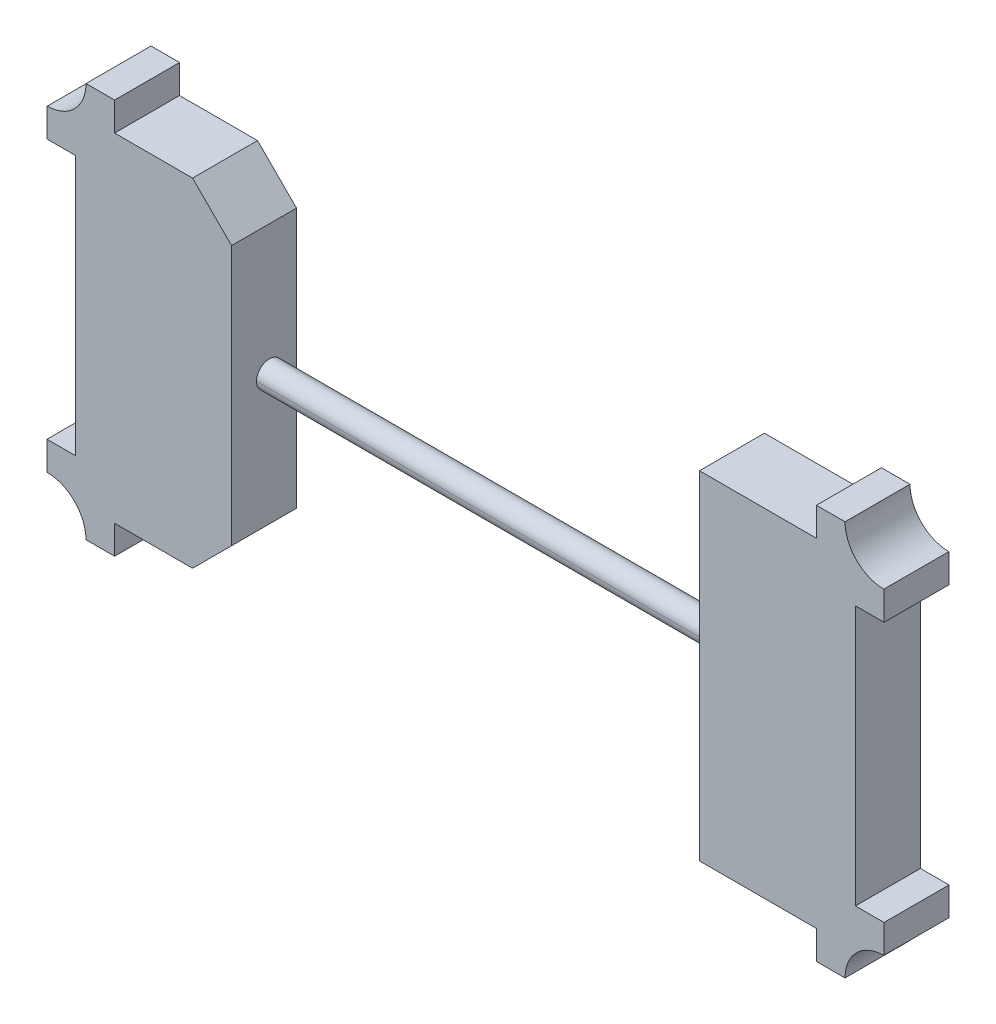
ISO-10303-21;
HEADER;
FILE_DESCRIPTION(('STEP AP214'),'2;1');
FILE_NAME('part.step','',(''),(''),'','','');
FILE_SCHEMA(('AUTOMOTIVE_DESIGN { 1 0 10303 214 1 1 1 1 }'));
ENDSEC;
DATA;
#1=APPLICATION_CONTEXT('core data for automotive mechanical design processes');
#2=APPLICATION_PROTOCOL_DEFINITION('international standard','automotive_design',2000,#1);
#3=PRODUCT_CONTEXT('',#1,'mechanical');
#4=PRODUCT('Part','Part','',(#3));
#5=PRODUCT_RELATED_PRODUCT_CATEGORY('part','',(#4));
#6=PRODUCT_DEFINITION_FORMATION('','',#4);
#7=PRODUCT_DEFINITION_CONTEXT('part definition',#1,'design');
#8=PRODUCT_DEFINITION('design','',#6,#7);
#9=PRODUCT_DEFINITION_SHAPE('','',#8);
#10=(LENGTH_UNIT() NAMED_UNIT(*) SI_UNIT(.MILLI.,.METRE.));
#11=(NAMED_UNIT(*) PLANE_ANGLE_UNIT() SI_UNIT($,.RADIAN.));
#12=(NAMED_UNIT(*) SI_UNIT($,.STERADIAN.) SOLID_ANGLE_UNIT());
#13=UNCERTAINTY_MEASURE_WITH_UNIT(LENGTH_MEASURE(1.E-05),#10,'distance_accuracy_value','');
#14=(GEOMETRIC_REPRESENTATION_CONTEXT(3) GLOBAL_UNCERTAINTY_ASSIGNED_CONTEXT((#13)) GLOBAL_UNIT_ASSIGNED_CONTEXT((#10,
#11,#12)) REPRESENTATION_CONTEXT('',''));
#15=CARTESIAN_POINT('',(0.,0.,0.));
#16=DIRECTION('',(0.,0.,1.));
#17=DIRECTION('',(1.,0.,0.));
#18=AXIS2_PLACEMENT_3D('',#15,#16,#17);
#19=CARTESIAN_POINT('',(-1.555,0.5,0.));
#20=DIRECTION('',(0.,-1.,0.));
#21=DIRECTION('',(-1.,0.,0.));
#22=AXIS2_PLACEMENT_3D('',#19,#20,#21);
#23=PLANE('',#22);
#24=DIRECTION('',(1.,0.,0.));
#25=VECTOR('',#24,1.);
#26=CARTESIAN_POINT('',(-1.26844322738,0.5,0.));
#27=LINE('',#26,#25);
#28=CARTESIAN_POINT('',(-1.61,0.5,0.));
#29=VERTEX_POINT('',#28);
#30=CARTESIAN_POINT('',(-1.5,0.5,0.));
#31=VERTEX_POINT('',#30);
#32=EDGE_CURVE('E474',#29,#31,#27,.T.);
#33=ORIENTED_EDGE('',*,*,#32,.T.);
#34=DIRECTION('',(0.,0.,-1.));
#35=VECTOR('',#34,1.);
#36=CARTESIAN_POINT('',(-1.5,0.5,0.));
#37=LINE('',#36,#35);
#38=CARTESIAN_POINT('',(-1.5,0.5,0.25));
#39=VERTEX_POINT('',#38);
#40=EDGE_CURVE('E11',#39,#31,#37,.T.);
#41=ORIENTED_EDGE('',*,*,#40,.F.);
#42=DIRECTION('',(1.,0.,0.));
#43=VECTOR('',#42,1.);
#44=CARTESIAN_POINT('',(-1.26844322738,0.5,0.25));
#45=LINE('',#44,#43);
#46=CARTESIAN_POINT('',(-1.61,0.5,0.25));
#47=VERTEX_POINT('',#46);
#48=EDGE_CURVE('E478',#47,#39,#45,.T.);
#49=ORIENTED_EDGE('',*,*,#48,.F.);
#50=DIRECTION('',(0.,0.,1.));
#51=VECTOR('',#50,1.);
#52=CARTESIAN_POINT('',(-1.61,0.5,0.));
#53=LINE('',#52,#51);
#54=EDGE_CURVE('E372',#29,#47,#53,.T.);
#55=ORIENTED_EDGE('',*,*,#54,.F.);
#56=EDGE_LOOP('',(#33,#41,#49,#55));
#57=FACE_BOUND('',#56,.T.);
#58=ADVANCED_FACE('F16',(#57),#23,.T.);
#59=CARTESIAN_POINT('',(-1.5,0.25,0.));
#60=DIRECTION('',(-1.,0.,0.));
#61=DIRECTION('',(0.,0.,1.));
#62=AXIS2_PLACEMENT_3D('',#59,#60,#61);
#63=PLANE('',#62);
#64=DIRECTION('',(0.,-1.,0.));
#65=VECTOR('',#64,1.);
#66=CARTESIAN_POINT('',(-1.5,0.,0.));
#67=LINE('',#66,#65);
#68=CARTESIAN_POINT('',(-1.5,-0.5,0.));
#69=VERTEX_POINT('',#68);
#70=EDGE_CURVE('E553',#31,#69,#67,.T.);
#71=ORIENTED_EDGE('',*,*,#70,.T.);
#72=DIRECTION('',(0.,0.,-1.));
#73=VECTOR('',#72,1.);
#74=CARTESIAN_POINT('',(-1.5,-0.5,0.));
#75=LINE('',#74,#73);
#76=CARTESIAN_POINT('',(-1.5,-0.5,0.25));
#77=VERTEX_POINT('',#76);
#78=EDGE_CURVE('E27',#77,#69,#75,.T.);
#79=ORIENTED_EDGE('',*,*,#78,.F.);
#80=DIRECTION('',(0.,-1.,0.));
#81=VECTOR('',#80,1.);
#82=CARTESIAN_POINT('',(-1.5,0.,0.25));
#83=LINE('',#82,#81);
#84=EDGE_CURVE('E314',#39,#77,#83,.T.);
#85=ORIENTED_EDGE('',*,*,#84,.F.);
#86=ORIENTED_EDGE('',*,*,#40,.T.);
#87=EDGE_LOOP('',(#71,#79,#85,#86));
#88=FACE_BOUND('',#87,.T.);
#89=ADVANCED_FACE('F663',(#88),#63,.T.);
#90=CARTESIAN_POINT('',(-1.555,-0.5,0.));
#91=DIRECTION('',(0.,1.,0.));
#92=DIRECTION('',(1.,0.,0.));
#93=AXIS2_PLACEMENT_3D('',#90,#91,#92);
#94=PLANE('',#93);
#95=DIRECTION('',(-1.,0.,0.));
#96=VECTOR('',#95,1.);
#97=CARTESIAN_POINT('',(-1.26844322738,-0.5,0.));
#98=LINE('',#97,#96);
#99=CARTESIAN_POINT('',(-1.61,-0.5,0.));
#100=VERTEX_POINT('',#99);
#101=EDGE_CURVE('E544',#69,#100,#98,.T.);
#102=ORIENTED_EDGE('',*,*,#101,.T.);
#103=DIRECTION('',(0.,0.,-1.));
#104=VECTOR('',#103,1.);
#105=CARTESIAN_POINT('',(-1.61,-0.5,0.));
#106=LINE('',#105,#104);
#107=CARTESIAN_POINT('',(-1.61,-0.5,0.25));
#108=VERTEX_POINT('',#107);
#109=EDGE_CURVE('E395',#108,#100,#106,.T.);
#110=ORIENTED_EDGE('',*,*,#109,.F.);
#111=DIRECTION('',(-1.,0.,0.));
#112=VECTOR('',#111,1.);
#113=CARTESIAN_POINT('',(-1.26844322738,-0.5,0.25));
#114=LINE('',#113,#112);
#115=EDGE_CURVE('E309',#77,#108,#114,.T.);
#116=ORIENTED_EDGE('',*,*,#115,.F.);
#117=ORIENTED_EDGE('',*,*,#78,.T.);
#118=EDGE_LOOP('',(#102,#110,#116,#117));
#119=FACE_BOUND('',#118,.T.);
#120=ADVANCED_FACE('F660',(#119),#94,.T.);
#121=CARTESIAN_POINT('',(-1.609601,-0.554998552699,0.));
#122=DIRECTION('',(-0.999973685438896,-0.00725454545452725,0.));
#123=DIRECTION('',(-0.00725454545452725,0.999973685438896,0.));
#124=AXIS2_PLACEMENT_3D('',#121,#122,#123);
#125=PLANE('',#124);
#126=DIRECTION('',(0.00725454545454425,-0.999973685438896,0.));
#127=VECTOR('',#126,1.);
#128=CARTESIAN_POINT('',(-1.61,-0.5,0.));
#129=LINE('',#128,#127);
#130=CARTESIAN_POINT('',(-1.609202,-0.609997105398,0.));
#131=VERTEX_POINT('',#130);
#132=EDGE_CURVE('E540',#100,#131,#129,.T.);
#133=ORIENTED_EDGE('',*,*,#132,.T.);
#134=DIRECTION('',(0.,0.,1.));
#135=VECTOR('',#134,1.);
#136=CARTESIAN_POINT('',(-1.609202,-0.609997105398,0.));
#137=LINE('',#136,#135);
#138=CARTESIAN_POINT('',(-1.609202,-0.609997105398,0.25));
#139=VERTEX_POINT('',#138);
#140=EDGE_CURVE('E342',#131,#139,#137,.T.);
#141=ORIENTED_EDGE('',*,*,#140,.T.);
#142=DIRECTION('',(0.00725454545454425,-0.999973685438896,0.));
#143=VECTOR('',#142,1.);
#144=CARTESIAN_POINT('',(-1.61,-0.5,0.25));
#145=LINE('',#144,#143);
#146=EDGE_CURVE('E313',#108,#139,#145,.T.);
#147=ORIENTED_EDGE('',*,*,#146,.F.);
#148=ORIENTED_EDGE('',*,*,#109,.T.);
#149=EDGE_LOOP('',(#133,#141,#147,#148));
#150=FACE_BOUND('',#149,.T.);
#151=ADVANCED_FACE('F657',(#150),#125,.T.);
#152=CARTESIAN_POINT('',(-1.609999999916,-0.759994982704,0.));
#153=DIRECTION('',(0.,0.,1.));
#154=DIRECTION('',(1.,0.,0.));
#155=AXIS2_PLACEMENT_3D('',#152,#153,#154);
#156=CYLINDRICAL_SURFACE('',#155,0.15);
#157=ORIENTED_EDGE('',*,*,#140,.F.);
#158=CARTESIAN_POINT('',(-1.609999999916,-0.759994982704,0.));
#159=DIRECTION('',(0.,0.,-1.));
#160=DIRECTION('',(1.,0.,0.));
#161=AXIS2_PLACEMENT_3D('',#158,#159,#160);
#162=CIRCLE('',#161,0.15);
#163=CARTESIAN_POINT('',(-1.46,-0.76,0.));
#164=VERTEX_POINT('',#163);
#165=EDGE_CURVE('E362',#131,#164,#162,.T.);
#166=ORIENTED_EDGE('',*,*,#165,.T.);
#167=DIRECTION('',(0.,0.,-1.));
#168=VECTOR('',#167,1.);
#169=CARTESIAN_POINT('',(-1.46,-0.76,0.));
#170=LINE('',#169,#168);
#171=CARTESIAN_POINT('',(-1.46,-0.76,0.25));
#172=VERTEX_POINT('',#171);
#173=EDGE_CURVE('E324',#172,#164,#170,.T.);
#174=ORIENTED_EDGE('',*,*,#173,.F.);
#175=CARTESIAN_POINT('',(-1.609999999916,-0.759994982704,0.25));
#176=DIRECTION('',(0.,0.,-1.));
#177=DIRECTION('',(1.,0.,0.));
#178=AXIS2_PLACEMENT_3D('',#175,#176,#177);
#179=CIRCLE('',#178,0.15);
#180=EDGE_CURVE('E396',#139,#172,#179,.T.);
#181=ORIENTED_EDGE('',*,*,#180,.F.);
#182=EDGE_LOOP('',(#157,#166,#174,#181));
#183=FACE_BOUND('',#182,.T.);
#184=ADVANCED_FACE('F655',(#183),#156,.F.);
#185=CARTESIAN_POINT('',(-1.405,-0.76,0.));
#186=DIRECTION('',(0.,-1.,0.));
#187=DIRECTION('',(-1.,0.,0.));
#188=AXIS2_PLACEMENT_3D('',#185,#186,#187);
#189=PLANE('',#188);
#190=DIRECTION('',(1.,0.,0.));
#191=VECTOR('',#190,1.);
#192=CARTESIAN_POINT('',(-1.26844322738,-0.76,0.));
#193=LINE('',#192,#191);
#194=CARTESIAN_POINT('',(-1.35,-0.76,0.));
#195=VERTEX_POINT('',#194);
#196=EDGE_CURVE('E318',#164,#195,#193,.T.);
#197=ORIENTED_EDGE('',*,*,#196,.T.);
#198=DIRECTION('',(0.,0.,-1.));
#199=VECTOR('',#198,1.);
#200=CARTESIAN_POINT('',(-1.35,-0.76,0.));
#201=LINE('',#200,#199);
#202=CARTESIAN_POINT('',(-1.35,-0.76,0.25));
#203=VERTEX_POINT('',#202);
#204=EDGE_CURVE('E320',#203,#195,#201,.T.);
#205=ORIENTED_EDGE('',*,*,#204,.F.);
#206=DIRECTION('',(1.,0.,0.));
#207=VECTOR('',#206,1.);
#208=CARTESIAN_POINT('',(-1.26844322738,-0.76,0.25));
#209=LINE('',#208,#207);
#210=EDGE_CURVE('E400',#172,#203,#209,.T.);
#211=ORIENTED_EDGE('',*,*,#210,.F.);
#212=ORIENTED_EDGE('',*,*,#173,.T.);
#213=EDGE_LOOP('',(#197,#205,#211,#212));
#214=FACE_BOUND('',#213,.T.);
#215=ADVANCED_FACE('F652',(#214),#189,.T.);
#216=CARTESIAN_POINT('',(-1.35,-0.705,0.));
#217=DIRECTION('',(1.,0.,0.));
#218=DIRECTION('',(0.,-1.,0.));
#219=AXIS2_PLACEMENT_3D('',#216,#217,#218);
#220=PLANE('',#219);
#221=DIRECTION('',(0.,1.,0.));
#222=VECTOR('',#221,1.);
#223=CARTESIAN_POINT('',(-1.35,0.,0.));
#224=LINE('',#223,#222);
#225=CARTESIAN_POINT('',(-1.35,-0.65,0.));
#226=VERTEX_POINT('',#225);
#227=EDGE_CURVE('E315',#195,#226,#224,.T.);
#228=ORIENTED_EDGE('',*,*,#227,.T.);
#229=DIRECTION('',(0.,0.,-1.));
#230=VECTOR('',#229,1.);
#231=CARTESIAN_POINT('',(-1.35,-0.65,0.));
#232=LINE('',#231,#230);
#233=CARTESIAN_POINT('',(-1.35,-0.65,0.25));
#234=VERTEX_POINT('',#233);
#235=EDGE_CURVE('E41',#234,#226,#232,.T.);
#236=ORIENTED_EDGE('',*,*,#235,.F.);
#237=DIRECTION('',(0.,1.,0.));
#238=VECTOR('',#237,1.);
#239=CARTESIAN_POINT('',(-1.35,0.,0.25));
#240=LINE('',#239,#238);
#241=EDGE_CURVE('E488',#203,#234,#240,.T.);
#242=ORIENTED_EDGE('',*,*,#241,.F.);
#243=ORIENTED_EDGE('',*,*,#204,.T.);
#244=EDGE_LOOP('',(#228,#236,#242,#243));
#245=FACE_BOUND('',#244,.T.);
#246=ADVANCED_FACE('F649',(#245),#220,.T.);
#247=CARTESIAN_POINT('',(-1.2,-0.65,0.));
#248=DIRECTION('',(0.,-1.,0.));
#249=DIRECTION('',(-1.,0.,0.));
#250=AXIS2_PLACEMENT_3D('',#247,#248,#249);
#251=PLANE('',#250);
#252=DIRECTION('',(1.,0.,0.));
#253=VECTOR('',#252,1.);
#254=CARTESIAN_POINT('',(-1.26844322738,-0.65,0.));
#255=LINE('',#254,#253);
#256=CARTESIAN_POINT('',(-1.05,-0.65,0.));
#257=VERTEX_POINT('',#256);
#258=EDGE_CURVE('E319',#226,#257,#255,.T.);
#259=ORIENTED_EDGE('',*,*,#258,.T.);
#260=DIRECTION('',(0.,0.,-1.));
#261=VECTOR('',#260,1.);
#262=CARTESIAN_POINT('',(-1.05,-0.65,0.));
#263=LINE('',#262,#261);
#264=CARTESIAN_POINT('',(-1.05,-0.65,0.25));
#265=VERTEX_POINT('',#264);
#266=EDGE_CURVE('E330',#265,#257,#263,.T.);
#267=ORIENTED_EDGE('',*,*,#266,.F.);
#268=DIRECTION('',(1.,0.,0.));
#269=VECTOR('',#268,1.);
#270=CARTESIAN_POINT('',(-1.26844322738,-0.65,0.25));
#271=LINE('',#270,#269);
#272=EDGE_CURVE('E492',#234,#265,#271,.T.);
#273=ORIENTED_EDGE('',*,*,#272,.F.);
#274=ORIENTED_EDGE('',*,*,#235,.T.);
#275=EDGE_LOOP('',(#259,#267,#273,#274));
#276=FACE_BOUND('',#275,.T.);
#277=ADVANCED_FACE('F643',(#276),#251,.T.);
#278=CARTESIAN_POINT('',(-1.35,0.705,0.));
#279=DIRECTION('',(1.,0.,0.));
#280=DIRECTION('',(0.,1.,0.));
#281=AXIS2_PLACEMENT_3D('',#278,#279,#280);
#282=PLANE('',#281);
#283=DIRECTION('',(0.,1.,0.));
#284=VECTOR('',#283,1.);
#285=CARTESIAN_POINT('',(-1.35,0.,0.));
#286=LINE('',#285,#284);
#287=CARTESIAN_POINT('',(-1.35,0.65,0.));
#288=VERTEX_POINT('',#287);
#289=CARTESIAN_POINT('',(-1.35,0.76,0.));
#290=VERTEX_POINT('',#289);
#291=EDGE_CURVE('E265',#288,#290,#286,.T.);
#292=ORIENTED_EDGE('',*,*,#291,.T.);
#293=DIRECTION('',(0.,0.,-1.));
#294=VECTOR('',#293,1.);
#295=CARTESIAN_POINT('',(-1.35,0.76,0.));
#296=LINE('',#295,#294);
#297=CARTESIAN_POINT('',(-1.35,0.76,0.25));
#298=VERTEX_POINT('',#297);
#299=EDGE_CURVE('E387',#298,#290,#296,.T.);
#300=ORIENTED_EDGE('',*,*,#299,.F.);
#301=DIRECTION('',(0.,1.,0.));
#302=VECTOR('',#301,1.);
#303=CARTESIAN_POINT('',(-1.35,0.,0.25));
#304=LINE('',#303,#302);
#305=CARTESIAN_POINT('',(-1.35,0.65,0.25));
#306=VERTEX_POINT('',#305);
#307=EDGE_CURVE('E333',#306,#298,#304,.T.);
#308=ORIENTED_EDGE('',*,*,#307,.F.);
#309=DIRECTION('',(0.,0.,1.));
#310=VECTOR('',#309,1.);
#311=CARTESIAN_POINT('',(-1.35,0.65,0.));
#312=LINE('',#311,#310);
#313=EDGE_CURVE('E376',#288,#306,#312,.T.);
#314=ORIENTED_EDGE('',*,*,#313,.F.);
#315=EDGE_LOOP('',(#292,#300,#308,#314));
#316=FACE_BOUND('',#315,.T.);
#317=ADVANCED_FACE('F679',(#316),#282,.T.);
#318=CARTESIAN_POINT('',(-1.405,0.76,0.));
#319=DIRECTION('',(0.,1.,0.));
#320=DIRECTION('',(1.,0.,0.));
#321=AXIS2_PLACEMENT_3D('',#318,#319,#320);
#322=PLANE('',#321);
#323=DIRECTION('',(-1.,0.,0.));
#324=VECTOR('',#323,1.);
#325=CARTESIAN_POINT('',(-1.26844322738,0.76,0.));
#326=LINE('',#325,#324);
#327=CARTESIAN_POINT('',(-1.46,0.76,0.));
#328=VERTEX_POINT('',#327);
#329=EDGE_CURVE('E517',#290,#328,#326,.T.);
#330=ORIENTED_EDGE('',*,*,#329,.T.);
#331=DIRECTION('',(0.,0.,1.));
#332=VECTOR('',#331,1.);
#333=CARTESIAN_POINT('',(-1.46,0.76,0.));
#334=LINE('',#333,#332);
#335=CARTESIAN_POINT('',(-1.46,0.76,0.25));
#336=VERTEX_POINT('',#335);
#337=EDGE_CURVE('E390',#328,#336,#334,.T.);
#338=ORIENTED_EDGE('',*,*,#337,.T.);
#339=DIRECTION('',(-1.,0.,0.));
#340=VECTOR('',#339,1.);
#341=CARTESIAN_POINT('',(-1.26844322738,0.76,0.25));
#342=LINE('',#341,#340);
#343=EDGE_CURVE('E427',#298,#336,#342,.T.);
#344=ORIENTED_EDGE('',*,*,#343,.F.);
#345=ORIENTED_EDGE('',*,*,#299,.T.);
#346=EDGE_LOOP('',(#330,#338,#344,#345));
#347=FACE_BOUND('',#346,.T.);
#348=ADVANCED_FACE('F676',(#347),#322,.T.);
#349=CARTESIAN_POINT('',(-1.609999999916,0.759994982704,0.));
#350=DIRECTION('',(0.,0.,1.));
#351=DIRECTION('',(1.,0.,0.));
#352=AXIS2_PLACEMENT_3D('',#349,#350,#351);
#353=CYLINDRICAL_SURFACE('',#352,0.15);
#354=ORIENTED_EDGE('',*,*,#337,.F.);
#355=CARTESIAN_POINT('',(-1.609999999916,0.759994982704,0.));
#356=DIRECTION('',(0.,0.,-1.));
#357=DIRECTION('',(1.,0.,0.));
#358=AXIS2_PLACEMENT_3D('',#355,#356,#357);
#359=CIRCLE('',#358,0.15);
#360=CARTESIAN_POINT('',(-1.609202,0.609997105398,0.));
#361=VERTEX_POINT('',#360);
#362=EDGE_CURVE('E521',#328,#361,#359,.T.);
#363=ORIENTED_EDGE('',*,*,#362,.T.);
#364=DIRECTION('',(0.,0.,-1.));
#365=VECTOR('',#364,1.);
#366=CARTESIAN_POINT('',(-1.609202,0.609997105398,0.));
#367=LINE('',#366,#365);
#368=CARTESIAN_POINT('',(-1.609202,0.609997105398,0.25));
#369=VERTEX_POINT('',#368);
#370=EDGE_CURVE('E375',#369,#361,#367,.T.);
#371=ORIENTED_EDGE('',*,*,#370,.F.);
#372=CARTESIAN_POINT('',(-1.609999999916,0.759994982704,0.25));
#373=DIRECTION('',(0.,0.,-1.));
#374=DIRECTION('',(1.,0.,0.));
#375=AXIS2_PLACEMENT_3D('',#372,#373,#374);
#376=CIRCLE('',#375,0.15);
#377=EDGE_CURVE('E422',#336,#369,#376,.T.);
#378=ORIENTED_EDGE('',*,*,#377,.F.);
#379=EDGE_LOOP('',(#354,#363,#371,#378));
#380=FACE_BOUND('',#379,.T.);
#381=ADVANCED_FACE('F671',(#380),#353,.F.);
#382=CARTESIAN_POINT('',(-1.609601,0.554998552699,0.));
#383=DIRECTION('',(-0.999973685438896,0.00725454545452525,0.));
#384=DIRECTION('',(0.,0.,1.));
#385=AXIS2_PLACEMENT_3D('',#382,#383,#384);
#386=PLANE('',#385);
#387=DIRECTION('',(-0.00725454545454425,-0.999973685438896,0.));
#388=VECTOR('',#387,1.);
#389=CARTESIAN_POINT('',(-1.609202,0.609997105398,0.));
#390=LINE('',#389,#388);
#391=EDGE_CURVE('E470',#361,#29,#390,.T.);
#392=ORIENTED_EDGE('',*,*,#391,.T.);
#393=ORIENTED_EDGE('',*,*,#54,.T.);
#394=DIRECTION('',(-0.00725454545454425,-0.999973685438896,0.));
#395=VECTOR('',#394,1.);
#396=CARTESIAN_POINT('',(-1.609202,0.609997105398,0.25));
#397=LINE('',#396,#395);
#398=EDGE_CURVE('E426',#369,#47,#397,.T.);
#399=ORIENTED_EDGE('',*,*,#398,.F.);
#400=ORIENTED_EDGE('',*,*,#370,.T.);
#401=EDGE_LOOP('',(#392,#393,#399,#400));
#402=FACE_BOUND('',#401,.T.);
#403=ADVANCED_FACE('F1028',(#402),#386,.T.);
#404=CARTESIAN_POINT('',(-1.2,0.65,0.));
#405=DIRECTION('',(0.,1.,0.));
#406=DIRECTION('',(1.,0.,0.));
#407=AXIS2_PLACEMENT_3D('',#404,#405,#406);
#408=PLANE('',#407);
#409=DIRECTION('',(-1.,0.,0.));
#410=VECTOR('',#409,1.);
#411=CARTESIAN_POINT('',(-1.26844322738,0.65,0.));
#412=LINE('',#411,#410);
#413=CARTESIAN_POINT('',(-1.05,0.65,0.));
#414=VERTEX_POINT('',#413);
#415=EDGE_CURVE('E255',#414,#288,#412,.T.);
#416=ORIENTED_EDGE('',*,*,#415,.T.);
#417=ORIENTED_EDGE('',*,*,#313,.T.);
#418=DIRECTION('',(-1.,0.,0.));
#419=VECTOR('',#418,1.);
#420=CARTESIAN_POINT('',(-1.26844322738,0.65,0.25));
#421=LINE('',#420,#419);
#422=CARTESIAN_POINT('',(-1.05,0.65,0.25));
#423=VERTEX_POINT('',#422);
#424=EDGE_CURVE('E274',#423,#306,#421,.T.);
#425=ORIENTED_EDGE('',*,*,#424,.F.);
#426=DIRECTION('',(0.,0.,1.));
#427=VECTOR('',#426,1.);
#428=CARTESIAN_POINT('',(-1.05,0.65,0.));
#429=LINE('',#428,#427);
#430=EDGE_CURVE('E271',#414,#423,#429,.T.);
#431=ORIENTED_EDGE('',*,*,#430,.F.);
#432=EDGE_LOOP('',(#416,#417,#425,#431));
#433=FACE_BOUND('',#432,.T.);
#434=ADVANCED_FACE('F272',(#433),#408,.T.);
#435=CARTESIAN_POINT('',(-1.26844322738,0.,0.25));
#436=DIRECTION('',(0.,0.,1.));
#437=DIRECTION('',(1.,0.,0.));
#438=AXIS2_PLACEMENT_3D('',#435,#436,#437);
#439=PLANE('',#438);
#440=ORIENTED_EDGE('',*,*,#307,.T.);
#441=ORIENTED_EDGE('',*,*,#343,.T.);
#442=ORIENTED_EDGE('',*,*,#377,.T.);
#443=ORIENTED_EDGE('',*,*,#398,.T.);
#444=ORIENTED_EDGE('',*,*,#48,.T.);
#445=ORIENTED_EDGE('',*,*,#84,.T.);
#446=ORIENTED_EDGE('',*,*,#115,.T.);
#447=ORIENTED_EDGE('',*,*,#146,.T.);
#448=ORIENTED_EDGE('',*,*,#180,.T.);
#449=ORIENTED_EDGE('',*,*,#210,.T.);
#450=ORIENTED_EDGE('',*,*,#241,.T.);
#451=ORIENTED_EDGE('',*,*,#272,.T.);
#452=DIRECTION('',(-0.707106781186548,-0.707106781186548,0.));
#453=VECTOR('',#452,1.);
#454=CARTESIAN_POINT('',(-0.975,-0.575,0.25));
#455=LINE('',#454,#453);
#456=CARTESIAN_POINT('',(-0.9,-0.5,0.25));
#457=VERTEX_POINT('',#456);
#458=EDGE_CURVE('E334',#457,#265,#455,.T.);
#459=ORIENTED_EDGE('',*,*,#458,.F.);
#460=DIRECTION('',(0.,-1.,0.));
#461=VECTOR('',#460,1.);
#462=CARTESIAN_POINT('',(-0.9,-0.25,0.25));
#463=LINE('',#462,#461);
#464=CARTESIAN_POINT('',(-0.9,0.5,0.25));
#465=VERTEX_POINT('',#464);
#466=EDGE_CURVE('E293',#465,#457,#463,.T.);
#467=ORIENTED_EDGE('',*,*,#466,.F.);
#468=DIRECTION('',(0.707106781186548,-0.707106781186548,0.));
#469=VECTOR('',#468,1.);
#470=CARTESIAN_POINT('',(-0.975,0.575,0.25));
#471=LINE('',#470,#469);
#472=EDGE_CURVE('E279',#423,#465,#471,.T.);
#473=ORIENTED_EDGE('',*,*,#472,.F.);
#474=ORIENTED_EDGE('',*,*,#424,.T.);
#475=EDGE_LOOP('',(#440,#441,#442,#443,#444,#445,#446,#447,#448,#449,#450,#451,#459,#467,#473,#474));
#476=FACE_BOUND('',#475,.T.);
#477=ADVANCED_FACE('F631',(#476),#439,.T.);
#478=CARTESIAN_POINT('',(-0.975,-0.575,0.));
#479=DIRECTION('',(0.707106781186548,-0.707106781186548,0.));
#480=DIRECTION('',(0.,0.,-1.));
#481=AXIS2_PLACEMENT_3D('',#478,#479,#480);
#482=PLANE('',#481);
#483=DIRECTION('',(0.707106781186548,0.707106781186548,0.));
#484=VECTOR('',#483,1.);
#485=CARTESIAN_POINT('',(-1.05,-0.65,0.));
#486=LINE('',#485,#484);
#487=CARTESIAN_POINT('',(-0.9,-0.5,0.));
#488=VERTEX_POINT('',#487);
#489=EDGE_CURVE('E268',#257,#488,#486,.T.);
#490=ORIENTED_EDGE('',*,*,#489,.T.);
#491=DIRECTION('',(0.,0.,-1.));
#492=VECTOR('',#491,1.);
#493=CARTESIAN_POINT('',(-0.9,-0.5,0.));
#494=LINE('',#493,#492);
#495=EDGE_CURVE('E286',#457,#488,#494,.T.);
#496=ORIENTED_EDGE('',*,*,#495,.F.);
#497=ORIENTED_EDGE('',*,*,#458,.T.);
#498=ORIENTED_EDGE('',*,*,#266,.T.);
#499=EDGE_LOOP('',(#490,#496,#497,#498));
#500=FACE_BOUND('',#499,.T.);
#501=ADVANCED_FACE('F640',(#500),#482,.T.);
#502=CARTESIAN_POINT('',(-1.26844322738,0.,0.));
#503=DIRECTION('',(0.,0.,1.));
#504=DIRECTION('',(1.,0.,0.));
#505=AXIS2_PLACEMENT_3D('',#502,#503,#504);
#506=PLANE('',#505);
#507=ORIENTED_EDGE('',*,*,#362,.F.);
#508=ORIENTED_EDGE('',*,*,#329,.F.);
#509=ORIENTED_EDGE('',*,*,#291,.F.);
#510=ORIENTED_EDGE('',*,*,#415,.F.);
#511=DIRECTION('',(-0.707106781186548,0.707106781186548,0.));
#512=VECTOR('',#511,1.);
#513=CARTESIAN_POINT('',(-0.975,0.575,0.));
#514=LINE('',#513,#512);
#515=CARTESIAN_POINT('',(-0.9,0.5,0.));
#516=VERTEX_POINT('',#515);
#517=EDGE_CURVE('E261',#516,#414,#514,.T.);
#518=ORIENTED_EDGE('',*,*,#517,.F.);
#519=DIRECTION('',(0.,1.,0.));
#520=VECTOR('',#519,1.);
#521=CARTESIAN_POINT('',(-0.9,-0.25,0.));
#522=LINE('',#521,#520);
#523=EDGE_CURVE('E513',#488,#516,#522,.T.);
#524=ORIENTED_EDGE('',*,*,#523,.F.);
#525=ORIENTED_EDGE('',*,*,#489,.F.);
#526=ORIENTED_EDGE('',*,*,#258,.F.);
#527=ORIENTED_EDGE('',*,*,#227,.F.);
#528=ORIENTED_EDGE('',*,*,#196,.F.);
#529=ORIENTED_EDGE('',*,*,#165,.F.);
#530=ORIENTED_EDGE('',*,*,#132,.F.);
#531=ORIENTED_EDGE('',*,*,#101,.F.);
#532=ORIENTED_EDGE('',*,*,#70,.F.);
#533=ORIENTED_EDGE('',*,*,#32,.F.);
#534=ORIENTED_EDGE('',*,*,#391,.F.);
#535=EDGE_LOOP('',(#507,#508,#509,#510,#518,#524,#525,#526,#527,#528,#529,#530,#531,#532,#533,#534));
#536=FACE_BOUND('',#535,.T.);
#537=ADVANCED_FACE('F258',(#536),#506,.F.);
#538=CARTESIAN_POINT('',(-0.975,0.575,0.));
#539=DIRECTION('',(0.707106781186548,0.707106781186548,0.));
#540=DIRECTION('',(0.,0.,-1.));
#541=AXIS2_PLACEMENT_3D('',#538,#539,#540);
#542=PLANE('',#541);
#543=ORIENTED_EDGE('',*,*,#517,.T.);
#544=ORIENTED_EDGE('',*,*,#430,.T.);
#545=ORIENTED_EDGE('',*,*,#472,.T.);
#546=DIRECTION('',(0.,0.,1.));
#547=VECTOR('',#546,1.);
#548=CARTESIAN_POINT('',(-0.9,0.5,0.));
#549=LINE('',#548,#547);
#550=EDGE_CURVE('E283',#516,#465,#549,.T.);
#551=ORIENTED_EDGE('',*,*,#550,.F.);
#552=EDGE_LOOP('',(#543,#544,#545,#551));
#553=FACE_BOUND('',#552,.T.);
#554=ADVANCED_FACE('F281',(#553),#542,.T.);
#555=CARTESIAN_POINT('',(-0.9,-0.25,0.));
#556=DIRECTION('',(1.,0.,0.));
#557=DIRECTION('',(0.,1.,0.));
#558=AXIS2_PLACEMENT_3D('',#555,#556,#557);
#559=PLANE('',#558);
#560=CARTESIAN_POINT('',(-0.9,0.,0.104128421099));
#561=DIRECTION('',(1.,0.,0.));
#562=DIRECTION('',(0.,0.,1.));
#563=AXIS2_PLACEMENT_3D('',#560,#561,#562);
#564=CIRCLE('',#563,0.05);
#565=CARTESIAN_POINT('',(-0.9,0.,0.154128421099));
#566=VERTEX_POINT('',#565);
#567=CARTESIAN_POINT('',(-0.9,0.,0.05412842109904));
#568=VERTEX_POINT('',#567);
#569=EDGE_CURVE('E516',#566,#568,#564,.T.);
#570=ORIENTED_EDGE('',*,*,#569,.F.);
#571=CARTESIAN_POINT('',(-0.9,0.,0.104128421099));
#572=DIRECTION('',(1.,0.,0.));
#573=DIRECTION('',(0.,0.,1.));
#574=AXIS2_PLACEMENT_3D('',#571,#572,#573);
#575=CIRCLE('',#574,0.05);
#576=EDGE_CURVE('E439',#568,#566,#575,.T.);
#577=ORIENTED_EDGE('',*,*,#576,.F.);
#578=EDGE_LOOP('',(#570,#577));
#579=FACE_BOUND('',#578,.T.);
#580=ORIENTED_EDGE('',*,*,#523,.T.);
#581=ORIENTED_EDGE('',*,*,#550,.T.);
#582=ORIENTED_EDGE('',*,*,#466,.T.);
#583=ORIENTED_EDGE('',*,*,#495,.T.);
#584=EDGE_LOOP('',(#580,#581,#582,#583));
#585=FACE_BOUND('',#584,.T.);
#586=ADVANCED_FACE('F634',(#579,#585),#559,.T.);
#587=CARTESIAN_POINT('',(0.9,0.,0.104128421099));
#588=DIRECTION('',(-1.,0.,0.));
#589=DIRECTION('',(0.,0.,1.));
#590=AXIS2_PLACEMENT_3D('',#587,#588,#589);
#591=CYLINDRICAL_SURFACE('',#590,0.05);
#592=DIRECTION('',(-1.,0.,0.));
#593=VECTOR('',#592,1.);
#594=CARTESIAN_POINT('',(0.9,0.,0.05412842109904));
#595=LINE('',#594,#593);
#596=CARTESIAN_POINT('',(0.9,0.,0.05412842109904));
#597=VERTEX_POINT('',#596);
#598=EDGE_CURVE('E435',#597,#568,#595,.T.);
#599=ORIENTED_EDGE('',*,*,#598,.F.);
#600=CARTESIAN_POINT('',(0.9,0.,0.104128421099));
#601=DIRECTION('',(1.,0.,0.));
#602=DIRECTION('',(0.,0.,1.));
#603=AXIS2_PLACEMENT_3D('',#600,#601,#602);
#604=CIRCLE('',#603,0.05);
#605=CARTESIAN_POINT('',(0.9,0.,0.154128421099));
#606=VERTEX_POINT('',#605);
#607=EDGE_CURVE('E404',#606,#597,#604,.T.);
#608=ORIENTED_EDGE('',*,*,#607,.F.);
#609=DIRECTION('',(-1.,0.,0.));
#610=VECTOR('',#609,1.);
#611=CARTESIAN_POINT('',(0.9,0.,0.154128421099));
#612=LINE('',#611,#610);
#613=EDGE_CURVE('E466',#606,#566,#612,.T.);
#614=ORIENTED_EDGE('',*,*,#613,.T.);
#615=ORIENTED_EDGE('',*,*,#569,.T.);
#616=EDGE_LOOP('',(#599,#608,#614,#615));
#617=FACE_BOUND('',#616,.T.);
#618=ADVANCED_FACE('F733',(#617),#591,.T.);
#619=CARTESIAN_POINT('',(1.252163190186,0.,0.25));
#620=DIRECTION('',(0.,0.,1.));
#621=DIRECTION('',(1.,0.,0.));
#622=AXIS2_PLACEMENT_3D('',#619,#620,#621);
#623=PLANE('',#622);
#624=DIRECTION('',(-0.00725454545454425,0.999973685438896,0.));
#625=VECTOR('',#624,1.);
#626=CARTESIAN_POINT('',(1.61,0.5,0.25));
#627=LINE('',#626,#625);
#628=CARTESIAN_POINT('',(1.61,0.5,0.25));
#629=VERTEX_POINT('',#628);
#630=CARTESIAN_POINT('',(1.609202,0.609997105398,0.25));
#631=VERTEX_POINT('',#630);
#632=EDGE_CURVE('E337',#629,#631,#627,.T.);
#633=ORIENTED_EDGE('',*,*,#632,.T.);
#634=CARTESIAN_POINT('',(1.609999999916,0.759994982704,0.25));
#635=DIRECTION('',(0.,0.,-1.));
#636=DIRECTION('',(1.,0.,0.));
#637=AXIS2_PLACEMENT_3D('',#634,#635,#636);
#638=CIRCLE('',#637,0.15);
#639=CARTESIAN_POINT('',(1.46,0.76,0.25));
#640=VERTEX_POINT('',#639);
#641=EDGE_CURVE('E335',#631,#640,#638,.T.);
#642=ORIENTED_EDGE('',*,*,#641,.T.);
#643=DIRECTION('',(-1.,0.,0.));
#644=VECTOR('',#643,1.);
#645=CARTESIAN_POINT('',(1.252163190186,0.76,0.25));
#646=LINE('',#645,#644);
#647=CARTESIAN_POINT('',(1.35,0.76,0.25));
#648=VERTEX_POINT('',#647);
#649=EDGE_CURVE('E413',#640,#648,#646,.T.);
#650=ORIENTED_EDGE('',*,*,#649,.T.);
#651=DIRECTION('',(0.,-1.,0.));
#652=VECTOR('',#651,1.);
#653=CARTESIAN_POINT('',(1.35,0.,0.25));
#654=LINE('',#653,#652);
#655=CARTESIAN_POINT('',(1.35,0.65,0.25));
#656=VERTEX_POINT('',#655);
#657=EDGE_CURVE('E297',#648,#656,#654,.T.);
#658=ORIENTED_EDGE('',*,*,#657,.T.);
#659=DIRECTION('',(1.,0.,0.));
#660=VECTOR('',#659,1.);
#661=CARTESIAN_POINT('',(1.125,0.65,0.25));
#662=LINE('',#661,#660);
#663=CARTESIAN_POINT('',(0.9,0.65,0.25));
#664=VERTEX_POINT('',#663);
#665=EDGE_CURVE('E20',#664,#656,#662,.T.);
#666=ORIENTED_EDGE('',*,*,#665,.F.);
#667=DIRECTION('',(0.,1.,0.));
#668=VECTOR('',#667,1.);
#669=CARTESIAN_POINT('',(0.9,0.325,0.25));
#670=LINE('',#669,#668);
#671=CARTESIAN_POINT('',(0.9,-0.65,0.25));
#672=VERTEX_POINT('',#671);
#673=EDGE_CURVE('E357',#672,#664,#670,.T.);
#674=ORIENTED_EDGE('',*,*,#673,.F.);
#675=DIRECTION('',(-1.,0.,0.));
#676=VECTOR('',#675,1.);
#677=CARTESIAN_POINT('',(1.125,-0.65,0.25));
#678=LINE('',#677,#676);
#679=CARTESIAN_POINT('',(1.35,-0.65,0.25));
#680=VERTEX_POINT('',#679);
#681=EDGE_CURVE('E358',#680,#672,#678,.T.);
#682=ORIENTED_EDGE('',*,*,#681,.F.);
#683=DIRECTION('',(0.,1.,0.));
#684=VECTOR('',#683,1.);
#685=CARTESIAN_POINT('',(1.35,-0.705,0.25));
#686=LINE('',#685,#684);
#687=CARTESIAN_POINT('',(1.35,-0.76,0.25));
#688=VERTEX_POINT('',#687);
#689=EDGE_CURVE('E363',#688,#680,#686,.T.);
#690=ORIENTED_EDGE('',*,*,#689,.F.);
#691=DIRECTION('',(-1.,0.,0.));
#692=VECTOR('',#691,1.);
#693=CARTESIAN_POINT('',(1.405,-0.76,0.25));
#694=LINE('',#693,#692);
#695=CARTESIAN_POINT('',(1.46,-0.76,0.25));
#696=VERTEX_POINT('',#695);
#697=EDGE_CURVE('E386',#696,#688,#694,.T.);
#698=ORIENTED_EDGE('',*,*,#697,.F.);
#699=CARTESIAN_POINT('',(1.609999999916,-0.759994982704,0.25));
#700=DIRECTION('',(0.,0.,-1.));
#701=DIRECTION('',(1.,0.,0.));
#702=AXIS2_PLACEMENT_3D('',#699,#700,#701);
#703=CIRCLE('',#702,0.15);
#704=CARTESIAN_POINT('',(1.609202,-0.609997105398,0.25));
#705=VERTEX_POINT('',#704);
#706=EDGE_CURVE('E383',#696,#705,#703,.T.);
#707=ORIENTED_EDGE('',*,*,#706,.T.);
#708=DIRECTION('',(-0.00725454545452725,-0.999973685438896,0.));
#709=VECTOR('',#708,1.);
#710=CARTESIAN_POINT('',(1.609601,-0.554998552699,0.25));
#711=LINE('',#710,#709);
#712=CARTESIAN_POINT('',(1.61,-0.5,0.25));
#713=VERTEX_POINT('',#712);
#714=EDGE_CURVE('E329',#713,#705,#711,.T.);
#715=ORIENTED_EDGE('',*,*,#714,.F.);
#716=DIRECTION('',(1.,0.,0.));
#717=VECTOR('',#716,1.);
#718=CARTESIAN_POINT('',(1.555,-0.5,0.25));
#719=LINE('',#718,#717);
#720=CARTESIAN_POINT('',(1.5,-0.5,0.25));
#721=VERTEX_POINT('',#720);
#722=EDGE_CURVE('E303',#721,#713,#719,.T.);
#723=ORIENTED_EDGE('',*,*,#722,.F.);
#724=DIRECTION('',(0.,-1.,0.));
#725=VECTOR('',#724,1.);
#726=CARTESIAN_POINT('',(1.5,-0.25,0.25));
#727=LINE('',#726,#725);
#728=CARTESIAN_POINT('',(1.5,0.5,0.25));
#729=VERTEX_POINT('',#728);
#730=EDGE_CURVE('E465',#729,#721,#727,.T.);
#731=ORIENTED_EDGE('',*,*,#730,.F.);
#732=DIRECTION('',(1.,0.,0.));
#733=VECTOR('',#732,1.);
#734=CARTESIAN_POINT('',(1.252163190186,0.5,0.25));
#735=LINE('',#734,#733);
#736=EDGE_CURVE('E349',#729,#629,#735,.T.);
#737=ORIENTED_EDGE('',*,*,#736,.T.);
#738=EDGE_LOOP('',(#633,#642,#650,#658,#666,#674,#682,#690,#698,#707,#715,#723,#731,#737));
#739=FACE_BOUND('',#738,.T.);
#740=ADVANCED_FACE('F710',(#739),#623,.T.);
#741=CARTESIAN_POINT('',(1.125,0.65,0.));
#742=DIRECTION('',(0.,1.,0.));
#743=DIRECTION('',(1.,0.,0.));
#744=AXIS2_PLACEMENT_3D('',#741,#742,#743);
#745=PLANE('',#744);
#746=DIRECTION('',(-1.,0.,0.));
#747=VECTOR('',#746,1.);
#748=CARTESIAN_POINT('',(1.252163190186,0.65,0.));
#749=LINE('',#748,#747);
#750=CARTESIAN_POINT('',(1.35,0.65,0.));
#751=VERTEX_POINT('',#750);
#752=CARTESIAN_POINT('',(0.9,0.65,0.));
#753=VERTEX_POINT('',#752);
#754=EDGE_CURVE('E418',#751,#753,#749,.T.);
#755=ORIENTED_EDGE('',*,*,#754,.T.);
#756=DIRECTION('',(0.,0.,-1.));
#757=VECTOR('',#756,1.);
#758=CARTESIAN_POINT('',(0.9,0.65,0.));
#759=LINE('',#758,#757);
#760=EDGE_CURVE('E401',#664,#753,#759,.T.);
#761=ORIENTED_EDGE('',*,*,#760,.F.);
#762=ORIENTED_EDGE('',*,*,#665,.T.);
#763=DIRECTION('',(0.,0.,1.));
#764=VECTOR('',#763,1.);
#765=CARTESIAN_POINT('',(1.35,0.65,0.));
#766=LINE('',#765,#764);
#767=EDGE_CURVE('E302',#751,#656,#766,.T.);
#768=ORIENTED_EDGE('',*,*,#767,.F.);
#769=EDGE_LOOP('',(#755,#761,#762,#768));
#770=FACE_BOUND('',#769,.T.);
#771=ADVANCED_FACE('F18',(#770),#745,.T.);
#772=CARTESIAN_POINT('',(0.9,0.325,0.));
#773=DIRECTION('',(-1.,0.,0.));
#774=DIRECTION('',(0.,0.,1.));
#775=AXIS2_PLACEMENT_3D('',#772,#773,#774);
#776=PLANE('',#775);
#777=ORIENTED_EDGE('',*,*,#607,.T.);
#778=CARTESIAN_POINT('',(0.9,0.,0.104128421099));
#779=DIRECTION('',(1.,0.,0.));
#780=DIRECTION('',(0.,0.,1.));
#781=AXIS2_PLACEMENT_3D('',#778,#779,#780);
#782=CIRCLE('',#781,0.05);
#783=EDGE_CURVE('E440',#597,#606,#782,.T.);
#784=ORIENTED_EDGE('',*,*,#783,.T.);
#785=EDGE_LOOP('',(#777,#784));
#786=FACE_BOUND('',#785,.T.);
#787=DIRECTION('',(0.,-1.,0.));
#788=VECTOR('',#787,1.);
#789=CARTESIAN_POINT('',(0.9,0.,0.));
#790=LINE('',#789,#788);
#791=CARTESIAN_POINT('',(0.9,-0.65,0.));
#792=VERTEX_POINT('',#791);
#793=EDGE_CURVE('E414',#753,#792,#790,.T.);
#794=ORIENTED_EDGE('',*,*,#793,.T.);
#795=DIRECTION('',(0.,0.,-1.));
#796=VECTOR('',#795,1.);
#797=CARTESIAN_POINT('',(0.9,-0.65,0.));
#798=LINE('',#797,#796);
#799=EDGE_CURVE('E354',#672,#792,#798,.T.);
#800=ORIENTED_EDGE('',*,*,#799,.F.);
#801=ORIENTED_EDGE('',*,*,#673,.T.);
#802=ORIENTED_EDGE('',*,*,#760,.T.);
#803=EDGE_LOOP('',(#794,#800,#801,#802));
#804=FACE_BOUND('',#803,.T.);
#805=ADVANCED_FACE('F740',(#786,#804),#776,.T.);
#806=CARTESIAN_POINT('',(1.125,-0.65,0.));
#807=DIRECTION('',(0.,-1.,0.));
#808=DIRECTION('',(0.,0.,-1.));
#809=AXIS2_PLACEMENT_3D('',#806,#807,#808);
#810=PLANE('',#809);
#811=DIRECTION('',(1.,0.,0.));
#812=VECTOR('',#811,1.);
#813=CARTESIAN_POINT('',(1.252163190186,-0.65,0.));
#814=LINE('',#813,#812);
#815=CARTESIAN_POINT('',(1.35,-0.65,0.));
#816=VERTEX_POINT('',#815);
#817=EDGE_CURVE('E419',#792,#816,#814,.T.);
#818=ORIENTED_EDGE('',*,*,#817,.T.);
#819=DIRECTION('',(0.,0.,-1.));
#820=VECTOR('',#819,1.);
#821=CARTESIAN_POINT('',(1.35,-0.65,0.));
#822=LINE('',#821,#820);
#823=EDGE_CURVE('E367',#680,#816,#822,.T.);
#824=ORIENTED_EDGE('',*,*,#823,.F.);
#825=ORIENTED_EDGE('',*,*,#681,.T.);
#826=ORIENTED_EDGE('',*,*,#799,.T.);
#827=EDGE_LOOP('',(#818,#824,#825,#826));
#828=FACE_BOUND('',#827,.T.);
#829=ADVANCED_FACE('F743',(#828),#810,.T.);
#830=CARTESIAN_POINT('',(1.35,-0.705,0.));
#831=DIRECTION('',(-1.,0.,0.));
#832=DIRECTION('',(0.,0.,1.));
#833=AXIS2_PLACEMENT_3D('',#830,#831,#832);
#834=PLANE('',#833);
#835=DIRECTION('',(0.,-1.,0.));
#836=VECTOR('',#835,1.);
#837=CARTESIAN_POINT('',(1.35,0.,0.));
#838=LINE('',#837,#836);
#839=CARTESIAN_POINT('',(1.35,-0.76,0.));
#840=VERTEX_POINT('',#839);
#841=EDGE_CURVE('E409',#816,#840,#838,.T.);
#842=ORIENTED_EDGE('',*,*,#841,.T.);
#843=DIRECTION('',(0.,0.,-1.));
#844=VECTOR('',#843,1.);
#845=CARTESIAN_POINT('',(1.35,-0.76,0.));
#846=LINE('',#845,#844);
#847=EDGE_CURVE('E368',#688,#840,#846,.T.);
#848=ORIENTED_EDGE('',*,*,#847,.F.);
#849=ORIENTED_EDGE('',*,*,#689,.T.);
#850=ORIENTED_EDGE('',*,*,#823,.T.);
#851=EDGE_LOOP('',(#842,#848,#849,#850));
#852=FACE_BOUND('',#851,.T.);
#853=ADVANCED_FACE('F985',(#852),#834,.T.);
#854=CARTESIAN_POINT('',(1.405,-0.76,0.));
#855=DIRECTION('',(0.,-1.,0.));
#856=DIRECTION('',(0.,0.,-1.));
#857=AXIS2_PLACEMENT_3D('',#854,#855,#856);
#858=PLANE('',#857);
#859=DIRECTION('',(1.,0.,0.));
#860=VECTOR('',#859,1.);
#861=CARTESIAN_POINT('',(1.252163190186,-0.76,0.));
#862=LINE('',#861,#860);
#863=CARTESIAN_POINT('',(1.46,-0.76,0.));
#864=VERTEX_POINT('',#863);
#865=EDGE_CURVE('E405',#840,#864,#862,.T.);
#866=ORIENTED_EDGE('',*,*,#865,.T.);
#867=DIRECTION('',(0.,0.,1.));
#868=VECTOR('',#867,1.);
#869=CARTESIAN_POINT('',(1.46,-0.76,0.));
#870=LINE('',#869,#868);
#871=EDGE_CURVE('E328',#864,#696,#870,.T.);
#872=ORIENTED_EDGE('',*,*,#871,.T.);
#873=ORIENTED_EDGE('',*,*,#697,.T.);
#874=ORIENTED_EDGE('',*,*,#847,.T.);
#875=EDGE_LOOP('',(#866,#872,#873,#874));
#876=FACE_BOUND('',#875,.T.);
#877=ADVANCED_FACE('F982',(#876),#858,.T.);
#878=CARTESIAN_POINT('',(1.609999999916,-0.759994982704,0.));
#879=DIRECTION('',(0.,0.,1.));
#880=DIRECTION('',(1.,0.,0.));
#881=AXIS2_PLACEMENT_3D('',#878,#879,#880);
#882=CYLINDRICAL_SURFACE('',#881,0.15);
#883=ORIENTED_EDGE('',*,*,#871,.F.);
#884=CARTESIAN_POINT('',(1.609999999916,-0.759994982704,0.));
#885=DIRECTION('',(0.,0.,-1.));
#886=DIRECTION('',(1.,0.,0.));
#887=AXIS2_PLACEMENT_3D('',#884,#885,#886);
#888=CIRCLE('',#887,0.15);
#889=CARTESIAN_POINT('',(1.609202,-0.609997105398,0.));
#890=VERTEX_POINT('',#889);
#891=EDGE_CURVE('E410',#864,#890,#888,.T.);
#892=ORIENTED_EDGE('',*,*,#891,.T.);
#893=DIRECTION('',(0.,0.,-1.));
#894=VECTOR('',#893,1.);
#895=CARTESIAN_POINT('',(1.609202,-0.609997105398,0.));
#896=LINE('',#895,#894);
#897=EDGE_CURVE('E325',#705,#890,#896,.T.);
#898=ORIENTED_EDGE('',*,*,#897,.F.);
#899=ORIENTED_EDGE('',*,*,#706,.F.);
#900=EDGE_LOOP('',(#883,#892,#898,#899));
#901=FACE_BOUND('',#900,.T.);
#902=ADVANCED_FACE('F980',(#901),#882,.F.);
#903=CARTESIAN_POINT('',(1.609601,-0.554998552699,0.));
#904=DIRECTION('',(0.999973685438896,-0.00725454545452725,0.));
#905=DIRECTION('',(0.,0.,-1.));
#906=AXIS2_PLACEMENT_3D('',#903,#904,#905);
#907=PLANE('',#906);
#908=DIRECTION('',(0.00725454545454425,0.999973685438896,0.));
#909=VECTOR('',#908,1.);
#910=CARTESIAN_POINT('',(1.609202,-0.609997105398,0.));
#911=LINE('',#910,#909);
#912=CARTESIAN_POINT('',(1.61,-0.5,0.));
#913=VERTEX_POINT('',#912);
#914=EDGE_CURVE('E381',#890,#913,#911,.T.);
#915=ORIENTED_EDGE('',*,*,#914,.T.);
#916=DIRECTION('',(0.,0.,-1.));
#917=VECTOR('',#916,1.);
#918=CARTESIAN_POINT('',(1.61,-0.5,0.));
#919=LINE('',#918,#917);
#920=EDGE_CURVE('E307',#713,#913,#919,.T.);
#921=ORIENTED_EDGE('',*,*,#920,.F.);
#922=ORIENTED_EDGE('',*,*,#714,.T.);
#923=ORIENTED_EDGE('',*,*,#897,.T.);
#924=EDGE_LOOP('',(#915,#921,#922,#923));
#925=FACE_BOUND('',#924,.T.);
#926=ADVANCED_FACE('F967',(#925),#907,.T.);
#927=CARTESIAN_POINT('',(1.555,-0.5,0.));
#928=DIRECTION('',(0.,1.,0.));
#929=DIRECTION('',(1.,0.,0.));
#930=AXIS2_PLACEMENT_3D('',#927,#928,#929);
#931=PLANE('',#930);
#932=DIRECTION('',(-1.,0.,0.));
#933=VECTOR('',#932,1.);
#934=CARTESIAN_POINT('',(1.252163190186,-0.5,0.));
#935=LINE('',#934,#933);
#936=CARTESIAN_POINT('',(1.5,-0.5,0.));
#937=VERTEX_POINT('',#936);
#938=EDGE_CURVE('E377',#913,#937,#935,.T.);
#939=ORIENTED_EDGE('',*,*,#938,.T.);
#940=DIRECTION('',(0.,0.,-1.));
#941=VECTOR('',#940,1.);
#942=CARTESIAN_POINT('',(1.5,-0.5,0.));
#943=LINE('',#942,#941);
#944=EDGE_CURVE('E308',#721,#937,#943,.T.);
#945=ORIENTED_EDGE('',*,*,#944,.F.);
#946=ORIENTED_EDGE('',*,*,#722,.T.);
#947=ORIENTED_EDGE('',*,*,#920,.T.);
#948=EDGE_LOOP('',(#939,#945,#946,#947));
#949=FACE_BOUND('',#948,.T.);
#950=ADVANCED_FACE('F962',(#949),#931,.T.);
#951=CARTESIAN_POINT('',(1.5,-0.25,0.));
#952=DIRECTION('',(1.,0.,0.));
#953=DIRECTION('',(0.,1.,0.));
#954=AXIS2_PLACEMENT_3D('',#951,#952,#953);
#955=PLANE('',#954);
#956=DIRECTION('',(0.,1.,0.));
#957=VECTOR('',#956,1.);
#958=CARTESIAN_POINT('',(1.5,0.,0.));
#959=LINE('',#958,#957);
#960=CARTESIAN_POINT('',(1.5,0.5,0.));
#961=VERTEX_POINT('',#960);
#962=EDGE_CURVE('E382',#937,#961,#959,.T.);
#963=ORIENTED_EDGE('',*,*,#962,.T.);
#964=DIRECTION('',(0.,0.,-1.));
#965=VECTOR('',#964,1.);
#966=CARTESIAN_POINT('',(1.5,0.5,0.));
#967=LINE('',#966,#965);
#968=EDGE_CURVE('E352',#729,#961,#967,.T.);
#969=ORIENTED_EDGE('',*,*,#968,.F.);
#970=ORIENTED_EDGE('',*,*,#730,.T.);
#971=ORIENTED_EDGE('',*,*,#944,.T.);
#972=EDGE_LOOP('',(#963,#969,#970,#971));
#973=FACE_BOUND('',#972,.T.);
#974=ADVANCED_FACE('F972',(#973),#955,.T.);
#975=CARTESIAN_POINT('',(1.555,0.5,0.));
#976=DIRECTION('',(0.,-1.,0.));
#977=DIRECTION('',(0.,0.,-1.));
#978=AXIS2_PLACEMENT_3D('',#975,#976,#977);
#979=PLANE('',#978);
#980=DIRECTION('',(1.,0.,0.));
#981=VECTOR('',#980,1.);
#982=CARTESIAN_POINT('',(1.252163190186,0.5,0.));
#983=LINE('',#982,#981);
#984=CARTESIAN_POINT('',(1.61,0.5,0.));
#985=VERTEX_POINT('',#984);
#986=EDGE_CURVE('E512',#961,#985,#983,.T.);
#987=ORIENTED_EDGE('',*,*,#986,.T.);
#988=DIRECTION('',(0.,0.,-1.));
#989=VECTOR('',#988,1.);
#990=CARTESIAN_POINT('',(1.61,0.5,0.));
#991=LINE('',#990,#989);
#992=EDGE_CURVE('E353',#629,#985,#991,.T.);
#993=ORIENTED_EDGE('',*,*,#992,.F.);
#994=ORIENTED_EDGE('',*,*,#736,.F.);
#995=ORIENTED_EDGE('',*,*,#968,.T.);
#996=EDGE_LOOP('',(#987,#993,#994,#995));
#997=FACE_BOUND('',#996,.T.);
#998=ADVANCED_FACE('F976',(#997),#979,.T.);
#999=CARTESIAN_POINT('',(1.609601,0.554998552699,0.));
#1000=DIRECTION('',(0.999973685438896,0.00725454545453025,0.));
#1001=DIRECTION('',(0.,0.,-1.));
#1002=AXIS2_PLACEMENT_3D('',#999,#1000,#1001);
#1003=PLANE('',#1002);
#1004=DIRECTION('',(-0.00725454545454425,0.999973685438896,0.));
#1005=VECTOR('',#1004,1.);
#1006=CARTESIAN_POINT('',(1.61,0.5,0.));
#1007=LINE('',#1006,#1005);
#1008=CARTESIAN_POINT('',(1.609202,0.609997105398,0.));
#1009=VERTEX_POINT('',#1008);
#1010=EDGE_CURVE('E347',#985,#1009,#1007,.T.);
#1011=ORIENTED_EDGE('',*,*,#1010,.T.);
#1012=DIRECTION('',(0.,0.,1.));
#1013=VECTOR('',#1012,1.);
#1014=CARTESIAN_POINT('',(1.609202,0.609997105398,0.));
#1015=LINE('',#1014,#1013);
#1016=EDGE_CURVE('E338',#1009,#631,#1015,.T.);
#1017=ORIENTED_EDGE('',*,*,#1016,.T.);
#1018=ORIENTED_EDGE('',*,*,#632,.F.);
#1019=ORIENTED_EDGE('',*,*,#992,.T.);
#1020=EDGE_LOOP('',(#1011,#1017,#1018,#1019));
#1021=FACE_BOUND('',#1020,.T.);
#1022=ADVANCED_FACE('F1069',(#1021),#1003,.T.);
#1023=CARTESIAN_POINT('',(1.609999999916,0.759994982704,0.));
#1024=DIRECTION('',(0.,0.,1.));
#1025=DIRECTION('',(1.,0.,0.));
#1026=AXIS2_PLACEMENT_3D('',#1023,#1024,#1025);
#1027=CYLINDRICAL_SURFACE('',#1026,0.15);
#1028=ORIENTED_EDGE('',*,*,#1016,.F.);
#1029=CARTESIAN_POINT('',(1.609999999916,0.759994982704,0.));
#1030=DIRECTION('',(0.,0.,-1.));
#1031=DIRECTION('',(1.,0.,0.));
#1032=AXIS2_PLACEMENT_3D('',#1029,#1030,#1031);
#1033=CIRCLE('',#1032,0.15);
#1034=CARTESIAN_POINT('',(1.46,0.76,0.));
#1035=VERTEX_POINT('',#1034);
#1036=EDGE_CURVE('E343',#1009,#1035,#1033,.T.);
#1037=ORIENTED_EDGE('',*,*,#1036,.T.);
#1038=DIRECTION('',(0.,0.,-1.));
#1039=VECTOR('',#1038,1.);
#1040=CARTESIAN_POINT('',(1.46,0.76,0.));
#1041=LINE('',#1040,#1039);
#1042=EDGE_CURVE('E428',#640,#1035,#1041,.T.);
#1043=ORIENTED_EDGE('',*,*,#1042,.F.);
#1044=ORIENTED_EDGE('',*,*,#641,.F.);
#1045=EDGE_LOOP('',(#1028,#1037,#1043,#1044));
#1046=FACE_BOUND('',#1045,.T.);
#1047=ADVANCED_FACE('F1061',(#1046),#1027,.F.);
#1048=CARTESIAN_POINT('',(1.405,0.76,0.));
#1049=DIRECTION('',(0.,1.,0.));
#1050=DIRECTION('',(1.,0.,0.));
#1051=AXIS2_PLACEMENT_3D('',#1048,#1049,#1050);
#1052=PLANE('',#1051);
#1053=DIRECTION('',(-1.,0.,0.));
#1054=VECTOR('',#1053,1.);
#1055=CARTESIAN_POINT('',(1.252163190186,0.76,0.));
#1056=LINE('',#1055,#1054);
#1057=CARTESIAN_POINT('',(1.35,0.76,0.));
#1058=VERTEX_POINT('',#1057);
#1059=EDGE_CURVE('E348',#1035,#1058,#1056,.T.);
#1060=ORIENTED_EDGE('',*,*,#1059,.T.);
#1061=DIRECTION('',(0.,0.,-1.));
#1062=VECTOR('',#1061,1.);
#1063=CARTESIAN_POINT('',(1.35,0.76,0.));
#1064=LINE('',#1063,#1062);
#1065=EDGE_CURVE('E301',#648,#1058,#1064,.T.);
#1066=ORIENTED_EDGE('',*,*,#1065,.F.);
#1067=ORIENTED_EDGE('',*,*,#649,.F.);
#1068=ORIENTED_EDGE('',*,*,#1042,.T.);
#1069=EDGE_LOOP('',(#1060,#1066,#1067,#1068));
#1070=FACE_BOUND('',#1069,.T.);
#1071=ADVANCED_FACE('F715',(#1070),#1052,.T.);
#1072=CARTESIAN_POINT('',(1.35,0.705,0.));
#1073=DIRECTION('',(-1.,0.,0.));
#1074=DIRECTION('',(0.,0.,1.));
#1075=AXIS2_PLACEMENT_3D('',#1072,#1073,#1074);
#1076=PLANE('',#1075);
#1077=DIRECTION('',(0.,-1.,0.));
#1078=VECTOR('',#1077,1.);
#1079=CARTESIAN_POINT('',(1.35,0.,0.));
#1080=LINE('',#1079,#1078);
#1081=EDGE_CURVE('E462',#1058,#751,#1080,.T.);
#1082=ORIENTED_EDGE('',*,*,#1081,.T.);
#1083=ORIENTED_EDGE('',*,*,#767,.T.);
#1084=ORIENTED_EDGE('',*,*,#657,.F.);
#1085=ORIENTED_EDGE('',*,*,#1065,.T.);
#1086=EDGE_LOOP('',(#1082,#1083,#1084,#1085));
#1087=FACE_BOUND('',#1086,.T.);
#1088=ADVANCED_FACE('F719',(#1087),#1076,.T.);
#1089=CARTESIAN_POINT('',(1.252163190186,0.,0.));
#1090=DIRECTION('',(0.,0.,1.));
#1091=DIRECTION('',(1.,0.,0.));
#1092=AXIS2_PLACEMENT_3D('',#1089,#1090,#1091);
#1093=PLANE('',#1092);
#1094=ORIENTED_EDGE('',*,*,#1059,.F.);
#1095=ORIENTED_EDGE('',*,*,#1036,.F.);
#1096=ORIENTED_EDGE('',*,*,#1010,.F.);
#1097=ORIENTED_EDGE('',*,*,#986,.F.);
#1098=ORIENTED_EDGE('',*,*,#962,.F.);
#1099=ORIENTED_EDGE('',*,*,#938,.F.);
#1100=ORIENTED_EDGE('',*,*,#914,.F.);
#1101=ORIENTED_EDGE('',*,*,#891,.F.);
#1102=ORIENTED_EDGE('',*,*,#865,.F.);
#1103=ORIENTED_EDGE('',*,*,#841,.F.);
#1104=ORIENTED_EDGE('',*,*,#817,.F.);
#1105=ORIENTED_EDGE('',*,*,#793,.F.);
#1106=ORIENTED_EDGE('',*,*,#754,.F.);
#1107=ORIENTED_EDGE('',*,*,#1081,.F.);
#1108=EDGE_LOOP('',(#1094,#1095,#1096,#1097,#1098,#1099,#1100,#1101,#1102,#1103,#1104,#1105,
#1106,#1107));
#1109=FACE_BOUND('',#1108,.T.);
#1110=ADVANCED_FACE('F750',(#1109),#1093,.F.);
#1111=CARTESIAN_POINT('',(0.9,0.,0.104128421099));
#1112=DIRECTION('',(-1.,0.,0.));
#1113=DIRECTION('',(0.,0.,1.));
#1114=AXIS2_PLACEMENT_3D('',#1111,#1112,#1113);
#1115=CYLINDRICAL_SURFACE('',#1114,0.05);
#1116=ORIENTED_EDGE('',*,*,#783,.F.);
#1117=ORIENTED_EDGE('',*,*,#598,.T.);
#1118=ORIENTED_EDGE('',*,*,#576,.T.);
#1119=ORIENTED_EDGE('',*,*,#613,.F.);
#1120=EDGE_LOOP('',(#1116,#1117,#1118,#1119));
#1121=FACE_BOUND('',#1120,.T.);
#1122=ADVANCED_FACE('F738',(#1121),#1115,.T.);
#1123=CLOSED_SHELL('',(#58,#89,#120,#151,#184,#215,#246,#277,#317,#348,#381,#403,#434,#477,#501,
#537,#554,#586,#618,#740,#771,#805,#829,#853,#877,#902,#926,#950,#974,#998,#1022,#1047,#1071,
#1088,#1110,#1122));
#1124=MANIFOLD_SOLID_BREP('B1',#1123);
#1125=ADVANCED_BREP_SHAPE_REPRESENTATION('',(#18,#1124),#14);
#1126=SHAPE_DEFINITION_REPRESENTATION(#9,#1125);
ENDSEC;
END-ISO-10303-21;
